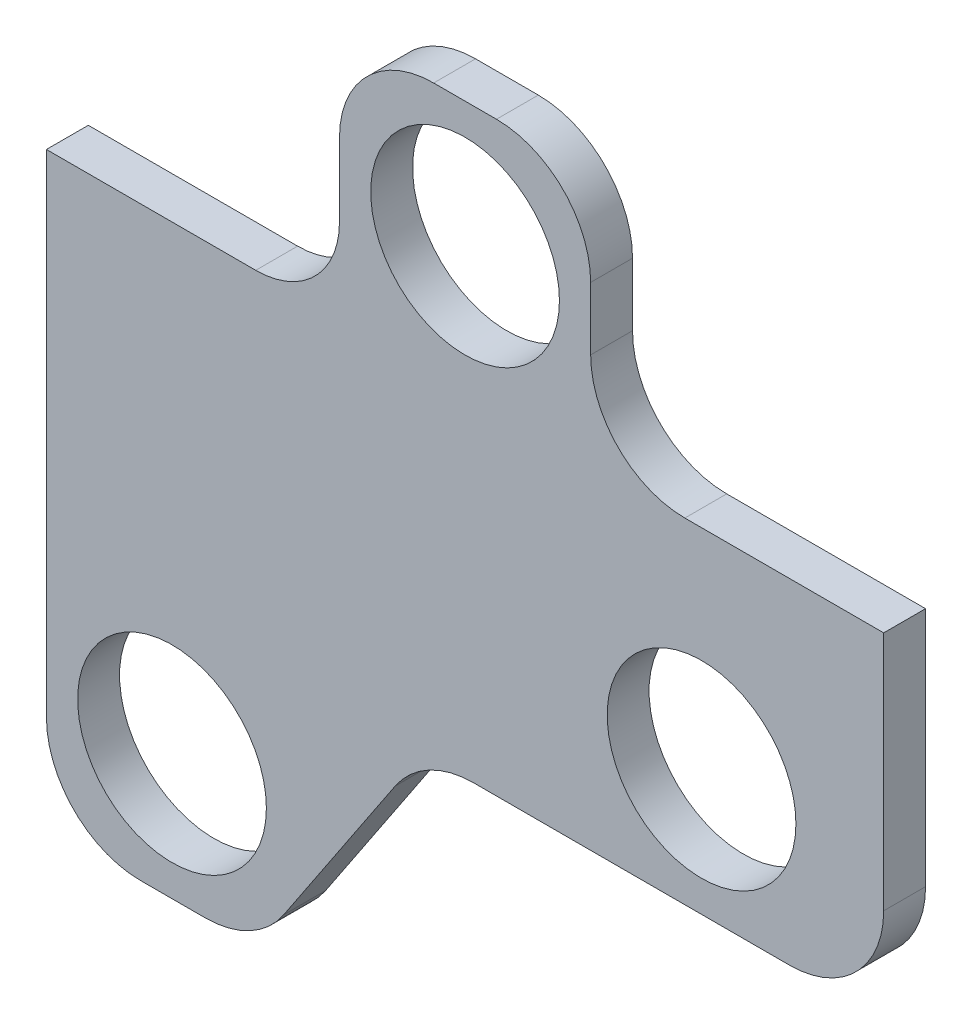
ISO-10303-21;
HEADER;
FILE_DESCRIPTION(('STEP AP214'),'2;1');
FILE_NAME('part.step','',(''),(''),'','','');
FILE_SCHEMA(('AUTOMOTIVE_DESIGN { 1 0 10303 214 1 1 1 1 }'));
ENDSEC;
DATA;
#1=APPLICATION_CONTEXT('core data for automotive mechanical design processes');
#2=APPLICATION_PROTOCOL_DEFINITION('international standard','automotive_design',2000,#1);
#3=PRODUCT_CONTEXT('',#1,'mechanical');
#4=PRODUCT('Part','Part','',(#3));
#5=PRODUCT_RELATED_PRODUCT_CATEGORY('part','',(#4));
#6=PRODUCT_DEFINITION_FORMATION('','',#4);
#7=PRODUCT_DEFINITION_CONTEXT('part definition',#1,'design');
#8=PRODUCT_DEFINITION('design','',#6,#7);
#9=PRODUCT_DEFINITION_SHAPE('','',#8);
#10=(LENGTH_UNIT() NAMED_UNIT(*) SI_UNIT(.MILLI.,.METRE.));
#11=(NAMED_UNIT(*) PLANE_ANGLE_UNIT() SI_UNIT($,.RADIAN.));
#12=(NAMED_UNIT(*) SI_UNIT($,.STERADIAN.) SOLID_ANGLE_UNIT());
#13=UNCERTAINTY_MEASURE_WITH_UNIT(LENGTH_MEASURE(1.E-05),#10,'distance_accuracy_value','');
#14=(GEOMETRIC_REPRESENTATION_CONTEXT(3) GLOBAL_UNCERTAINTY_ASSIGNED_CONTEXT((#13)) GLOBAL_UNIT_ASSIGNED_CONTEXT((#10,
#11,#12)) REPRESENTATION_CONTEXT('',''));
#15=CARTESIAN_POINT('',(0.,0.,0.));
#16=DIRECTION('',(0.,0.,1.));
#17=DIRECTION('',(1.,0.,0.));
#18=AXIS2_PLACEMENT_3D('',#15,#16,#17);
#19=CARTESIAN_POINT('',(0.,44.45,6.35));
#20=DIRECTION('',(0.,1.,0.));
#21=DIRECTION('',(0.,0.,1.));
#22=AXIS2_PLACEMENT_3D('',#19,#20,#21);
#23=PLANE('',#22);
#24=DIRECTION('',(1.,0.,0.));
#25=VECTOR('',#24,1.);
#26=CARTESIAN_POINT('',(0.,44.45,0.));
#27=LINE('',#26,#25);
#28=CARTESIAN_POINT('',(33.3375,44.45,0.));
#29=VERTEX_POINT('',#28);
#30=CARTESIAN_POINT('',(63.5,44.45,0.));
#31=VERTEX_POINT('',#30);
#32=EDGE_CURVE('E218',#29,#31,#27,.T.);
#33=ORIENTED_EDGE('',*,*,#32,.F.);
#34=DIRECTION('',(0.,0.,1.));
#35=VECTOR('',#34,1.);
#36=CARTESIAN_POINT('',(33.3375,44.45,6.35));
#37=LINE('',#36,#35);
#38=CARTESIAN_POINT('',(33.3375,44.45,6.35));
#39=VERTEX_POINT('',#38);
#40=EDGE_CURVE('E171',#29,#39,#37,.T.);
#41=ORIENTED_EDGE('',*,*,#40,.T.);
#42=DIRECTION('',(1.,0.,0.));
#43=VECTOR('',#42,1.);
#44=CARTESIAN_POINT('',(0.,44.45,6.35));
#45=LINE('',#44,#43);
#46=CARTESIAN_POINT('',(63.5,44.45,6.35));
#47=VERTEX_POINT('',#46);
#48=EDGE_CURVE('E165',#39,#47,#45,.T.);
#49=ORIENTED_EDGE('',*,*,#48,.T.);
#50=DIRECTION('',(0.,0.,-1.));
#51=VECTOR('',#50,1.);
#52=CARTESIAN_POINT('',(63.5,44.45,6.35));
#53=LINE('',#52,#51);
#54=EDGE_CURVE('E168',#47,#31,#53,.T.);
#55=ORIENTED_EDGE('',*,*,#54,.T.);
#56=EDGE_LOOP('',(#33,#41,#49,#55));
#57=FACE_BOUND('',#56,.T.);
#58=ADVANCED_FACE('F39',(#57),#23,.T.);
#59=CARTESIAN_POINT('',(-1.46538461538461,0.976923076923073,6.35));
#60=DIRECTION('',(0.832050294337844,-0.554700196225228,0.));
#61=DIRECTION('',(0.554700196225228,0.832050294337844,0.));
#62=AXIS2_PLACEMENT_3D('',#59,#60,#61);
#63=PLANE('',#62);
#64=DIRECTION('',(-0.554700196225228,-0.832050294337844,0.));
#65=VECTOR('',#64,1.);
#66=CARTESIAN_POINT('',(-1.46538461538461,0.976923076923073,0.));
#67=LINE('',#66,#65);
#68=CARTESIAN_POINT('',(-10.5914806309547,-12.712220946432,0.));
#69=VERTEX_POINT('',#68);
#70=CARTESIAN_POINT('',(-27.5085193690452,-38.0877790535679,0.));
#71=VERTEX_POINT('',#70);
#72=EDGE_CURVE('E211',#69,#71,#67,.T.);
#73=ORIENTED_EDGE('',*,*,#72,.F.);
#74=DIRECTION('',(0.,0.,-1.));
#75=VECTOR('',#74,1.);
#76=CARTESIAN_POINT('',(-10.5914806309547,-12.712220946432,6.35));
#77=LINE('',#76,#75);
#78=CARTESIAN_POINT('',(-10.5914806309547,-12.712220946432,6.35));
#79=VERTEX_POINT('',#78);
#80=EDGE_CURVE('E249',#69,#79,#77,.F.);
#81=ORIENTED_EDGE('',*,*,#80,.T.);
#82=DIRECTION('',(-0.554700196225228,-0.832050294337844,0.));
#83=VECTOR('',#82,1.);
#84=CARTESIAN_POINT('',(-1.46538461538461,0.976923076923073,6.35));
#85=LINE('',#84,#83);
#86=CARTESIAN_POINT('',(-27.5085193690452,-38.0877790535679,6.35));
#87=VERTEX_POINT('',#86);
#88=EDGE_CURVE('E194',#79,#87,#85,.T.);
#89=ORIENTED_EDGE('',*,*,#88,.T.);
#90=DIRECTION('',(0.,0.,-1.));
#91=VECTOR('',#90,1.);
#92=CARTESIAN_POINT('',(-27.5085193690453,-38.0877790535679,0.));
#93=LINE('',#92,#91);
#94=EDGE_CURVE('E246',#87,#71,#93,.T.);
#95=ORIENTED_EDGE('',*,*,#94,.T.);
#96=EDGE_LOOP('',(#73,#81,#89,#95));
#97=FACE_BOUND('',#96,.T.);
#98=ADVANCED_FACE('F323',(#97),#63,.T.);
#99=CARTESIAN_POINT('',(0.,-6.34999999999999,6.35));
#100=DIRECTION('',(0.,-1.,0.));
#101=DIRECTION('',(1.,0.,0.));
#102=AXIS2_PLACEMENT_3D('',#99,#100,#101);
#103=PLANE('',#102);
#104=DIRECTION('',(-1.,0.,0.));
#105=VECTOR('',#104,1.);
#106=CARTESIAN_POINT('',(0.,-6.34999999999999,0.));
#107=LINE('',#106,#105);
#108=CARTESIAN_POINT('',(49.2125,-6.34999999999999,0.));
#109=VERTEX_POINT('',#108);
#110=CARTESIAN_POINT('',(1.29643794939727,-6.34999999999999,0.));
#111=VERTEX_POINT('',#110);
#112=EDGE_CURVE('E214',#109,#111,#107,.T.);
#113=ORIENTED_EDGE('',*,*,#112,.F.);
#114=DIRECTION('',(0.,0.,-1.));
#115=VECTOR('',#114,1.);
#116=CARTESIAN_POINT('',(49.2125,-6.34999999999999,6.35));
#117=LINE('',#116,#115);
#118=CARTESIAN_POINT('',(49.2125,-6.34999999999999,6.35));
#119=VERTEX_POINT('',#118);
#120=EDGE_CURVE('E239',#109,#119,#117,.F.);
#121=ORIENTED_EDGE('',*,*,#120,.T.);
#122=DIRECTION('',(-1.,0.,0.));
#123=VECTOR('',#122,1.);
#124=CARTESIAN_POINT('',(0.,-6.34999999999999,6.35));
#125=LINE('',#124,#123);
#126=CARTESIAN_POINT('',(1.29643794939727,-6.34999999999999,6.35));
#127=VERTEX_POINT('',#126);
#128=EDGE_CURVE('E191',#119,#127,#125,.T.);
#129=ORIENTED_EDGE('',*,*,#128,.T.);
#130=DIRECTION('',(0.,0.,-1.));
#131=VECTOR('',#130,1.);
#132=CARTESIAN_POINT('',(1.29643794939727,-6.34999999999999,0.));
#133=LINE('',#132,#131);
#134=EDGE_CURVE('E236',#127,#111,#133,.T.);
#135=ORIENTED_EDGE('',*,*,#134,.T.);
#136=EDGE_LOOP('',(#113,#121,#129,#135));
#137=FACE_BOUND('',#136,.T.);
#138=ADVANCED_FACE('F359',(#137),#103,.T.);
#139=CARTESIAN_POINT('',(63.5,0.,6.35));
#140=DIRECTION('',(1.,0.,0.));
#141=DIRECTION('',(0.,0.,-1.));
#142=AXIS2_PLACEMENT_3D('',#139,#140,#141);
#143=PLANE('',#142);
#144=DIRECTION('',(0.,-1.,0.));
#145=VECTOR('',#144,1.);
#146=CARTESIAN_POINT('',(63.5,0.,6.35));
#147=LINE('',#146,#145);
#148=CARTESIAN_POINT('',(63.5,7.93750000000001,6.35));
#149=VERTEX_POINT('',#148);
#150=EDGE_CURVE('E174',#47,#149,#147,.T.);
#151=ORIENTED_EDGE('',*,*,#150,.T.);
#152=DIRECTION('',(0.,0.,-1.));
#153=VECTOR('',#152,1.);
#154=CARTESIAN_POINT('',(63.5,7.93750000000001,6.35));
#155=LINE('',#154,#153);
#156=CARTESIAN_POINT('',(63.5,7.93750000000001,0.));
#157=VERTEX_POINT('',#156);
#158=EDGE_CURVE('E183',#149,#157,#155,.T.);
#159=ORIENTED_EDGE('',*,*,#158,.T.);
#160=DIRECTION('',(0.,-1.,0.));
#161=VECTOR('',#160,1.);
#162=CARTESIAN_POINT('',(63.5,0.,0.));
#163=LINE('',#162,#161);
#164=EDGE_CURVE('E182',#31,#157,#163,.T.);
#165=ORIENTED_EDGE('',*,*,#164,.F.);
#166=ORIENTED_EDGE('',*,*,#54,.F.);
#167=EDGE_LOOP('',(#151,#159,#165,#166));
#168=FACE_BOUND('',#167,.T.);
#169=ADVANCED_FACE('F178',(#168),#143,.T.);
#170=CARTESIAN_POINT('',(-63.5,44.45,6.35));
#171=VERTEX_POINT('',#170);
#172=CARTESIAN_POINT('',(-31.75,44.45,6.35));
#173=VERTEX_POINT('',#172);
#174=EDGE_CURVE('E173',#171,#173,#45,.T.);
#175=ORIENTED_EDGE('',*,*,#174,.T.);
#176=DIRECTION('',(0.,0.,1.));
#177=VECTOR('',#176,1.);
#178=CARTESIAN_POINT('',(-31.75,44.45,0.));
#179=LINE('',#178,#177);
#180=CARTESIAN_POINT('',(-31.75,44.45,0.));
#181=VERTEX_POINT('',#180);
#182=EDGE_CURVE('E60',#173,#181,#179,.F.);
#183=ORIENTED_EDGE('',*,*,#182,.T.);
#184=CARTESIAN_POINT('',(-63.5,44.45,0.));
#185=VERTEX_POINT('',#184);
#186=EDGE_CURVE('E219',#185,#181,#27,.T.);
#187=ORIENTED_EDGE('',*,*,#186,.F.);
#188=DIRECTION('',(0.,0.,-1.));
#189=VECTOR('',#188,1.);
#190=CARTESIAN_POINT('',(-63.5,44.45,6.35));
#191=LINE('',#190,#189);
#192=EDGE_CURVE('E184',#171,#185,#191,.T.);
#193=ORIENTED_EDGE('',*,*,#192,.F.);
#194=EDGE_LOOP('',(#175,#183,#187,#193));
#195=FACE_BOUND('',#194,.T.);
#196=ADVANCED_FACE('F345',(#195),#23,.T.);
#197=CARTESIAN_POINT('',(-63.5,0.,6.35));
#198=DIRECTION('',(1.,0.,0.));
#199=DIRECTION('',(0.,1.,0.));
#200=AXIS2_PLACEMENT_3D('',#197,#198,#199);
#201=PLANE('',#200);
#202=DIRECTION('',(0.,-1.,0.));
#203=VECTOR('',#202,1.);
#204=CARTESIAN_POINT('',(-63.5,0.,0.));
#205=LINE('',#204,#203);
#206=CARTESIAN_POINT('',(-63.4999999999999,-30.1625,0.));
#207=VERTEX_POINT('',#206);
#208=EDGE_CURVE('E221',#185,#207,#205,.T.);
#209=ORIENTED_EDGE('',*,*,#208,.T.);
#210=DIRECTION('',(0.,0.,-1.));
#211=VECTOR('',#210,1.);
#212=CARTESIAN_POINT('',(-63.4999999999999,-30.1625,6.35));
#213=LINE('',#212,#211);
#214=CARTESIAN_POINT('',(-63.4999999999999,-30.1625,6.35));
#215=VERTEX_POINT('',#214);
#216=EDGE_CURVE('E256',#207,#215,#213,.F.);
#217=ORIENTED_EDGE('',*,*,#216,.T.);
#218=DIRECTION('',(0.,-1.,0.));
#219=VECTOR('',#218,1.);
#220=CARTESIAN_POINT('',(-63.5,0.,6.35));
#221=LINE('',#220,#219);
#222=EDGE_CURVE('E198',#171,#215,#221,.T.);
#223=ORIENTED_EDGE('',*,*,#222,.F.);
#224=ORIENTED_EDGE('',*,*,#192,.T.);
#225=EDGE_LOOP('',(#209,#217,#223,#224));
#226=FACE_BOUND('',#225,.T.);
#227=ADVANCED_FACE('F343',(#226),#201,.F.);
#228=CARTESIAN_POINT('',(-44.45,-25.4,6.35));
#229=DIRECTION('',(0.,0.,-1.));
#230=DIRECTION('',(-1.,0.,0.));
#231=AXIS2_PLACEMENT_3D('',#228,#229,#230);
#232=CYLINDRICAL_SURFACE('',#231,14.3129);
#233=CARTESIAN_POINT('',(-44.45,-25.4,6.35));
#234=DIRECTION('',(0.,0.,1.));
#235=DIRECTION('',(1.,0.,0.));
#236=AXIS2_PLACEMENT_3D('',#233,#234,#235);
#237=CIRCLE('',#236,14.3129);
#238=CARTESIAN_POINT('',(-30.1371,-25.4,6.35));
#239=VERTEX_POINT('',#238);
#240=EDGE_CURVE('E316',#239,#239,#237,.T.);
#241=ORIENTED_EDGE('',*,*,#240,.T.);
#242=EDGE_LOOP('',(#241));
#243=FACE_BOUND('',#242,.T.);
#244=CARTESIAN_POINT('',(-44.45,-25.4,0.));
#245=DIRECTION('',(0.,0.,1.));
#246=DIRECTION('',(1.,0.,0.));
#247=AXIS2_PLACEMENT_3D('',#244,#245,#246);
#248=CIRCLE('',#247,14.3129);
#249=CARTESIAN_POINT('',(-30.1371,-25.4,0.));
#250=VERTEX_POINT('',#249);
#251=EDGE_CURVE('E207',#250,#250,#248,.T.);
#252=ORIENTED_EDGE('',*,*,#251,.F.);
#253=EDGE_LOOP('',(#252));
#254=FACE_BOUND('',#253,.T.);
#255=ADVANCED_FACE('F368',(#243,#254),#232,.F.);
#256=CARTESIAN_POINT('',(35.8718525682768,12.7,6.35));
#257=DIRECTION('',(0.,0.,-1.));
#258=DIRECTION('',(-1.,0.,0.));
#259=AXIS2_PLACEMENT_3D('',#256,#257,#258);
#260=CYLINDRICAL_SURFACE('',#259,14.3129);
#261=CARTESIAN_POINT('',(35.8718525682768,12.7,6.35));
#262=DIRECTION('',(0.,0.,1.));
#263=DIRECTION('',(1.,0.,0.));
#264=AXIS2_PLACEMENT_3D('',#261,#262,#263);
#265=CIRCLE('',#264,14.3129);
#266=CARTESIAN_POINT('',(50.1847525682768,12.7,6.35));
#267=VERTEX_POINT('',#266);
#268=EDGE_CURVE('E227',#267,#267,#265,.T.);
#269=ORIENTED_EDGE('',*,*,#268,.T.);
#270=EDGE_LOOP('',(#269));
#271=FACE_BOUND('',#270,.T.);
#272=CARTESIAN_POINT('',(35.8718525682768,12.7,0.));
#273=DIRECTION('',(0.,0.,1.));
#274=DIRECTION('',(1.,0.,0.));
#275=AXIS2_PLACEMENT_3D('',#272,#273,#274);
#276=CIRCLE('',#275,14.3129);
#277=CARTESIAN_POINT('',(50.1847525682768,12.7,0.));
#278=VERTEX_POINT('',#277);
#279=EDGE_CURVE('E204',#278,#278,#276,.T.);
#280=ORIENTED_EDGE('',*,*,#279,.F.);
#281=EDGE_LOOP('',(#280));
#282=FACE_BOUND('',#281,.T.);
#283=ADVANCED_FACE('F377',(#271,#282),#260,.F.);
#284=CARTESIAN_POINT('',(0.,-44.45,6.35));
#285=DIRECTION('',(0.,1.,0.));
#286=DIRECTION('',(0.,0.,1.));
#287=AXIS2_PLACEMENT_3D('',#284,#285,#286);
#288=PLANE('',#287);
#289=DIRECTION('',(1.,0.,0.));
#290=VECTOR('',#289,1.);
#291=CARTESIAN_POINT('',(0.,-44.45,0.));
#292=LINE('',#291,#290);
#293=CARTESIAN_POINT('',(-49.2124999999999,-44.45,0.));
#294=VERTEX_POINT('',#293);
#295=CARTESIAN_POINT('',(-39.3964379493972,-44.45,0.));
#296=VERTEX_POINT('',#295);
#297=EDGE_CURVE('E224',#294,#296,#292,.T.);
#298=ORIENTED_EDGE('',*,*,#297,.T.);
#299=DIRECTION('',(0.,0.,-1.));
#300=VECTOR('',#299,1.);
#301=CARTESIAN_POINT('',(-39.3964379493972,-44.45,6.35));
#302=LINE('',#301,#300);
#303=CARTESIAN_POINT('',(-39.3964379493972,-44.45,6.35));
#304=VERTEX_POINT('',#303);
#305=EDGE_CURVE('E254',#296,#304,#302,.F.);
#306=ORIENTED_EDGE('',*,*,#305,.T.);
#307=DIRECTION('',(1.,0.,0.));
#308=VECTOR('',#307,1.);
#309=CARTESIAN_POINT('',(0.,-44.45,6.35));
#310=LINE('',#309,#308);
#311=CARTESIAN_POINT('',(-49.2124999999999,-44.45,6.35));
#312=VERTEX_POINT('',#311);
#313=EDGE_CURVE('E201',#312,#304,#310,.T.);
#314=ORIENTED_EDGE('',*,*,#313,.F.);
#315=DIRECTION('',(0.,0.,-1.));
#316=VECTOR('',#315,1.);
#317=CARTESIAN_POINT('',(-49.2124999999999,-44.45,6.35));
#318=LINE('',#317,#316);
#319=EDGE_CURVE('E251',#312,#294,#318,.T.);
#320=ORIENTED_EDGE('',*,*,#319,.T.);
#321=EDGE_LOOP('',(#298,#306,#314,#320));
#322=FACE_BOUND('',#321,.T.);
#323=ADVANCED_FACE('F334',(#322),#288,.F.);
#324=CARTESIAN_POINT('',(0.,0.,6.35));
#325=DIRECTION('',(0.,0.,1.));
#326=DIRECTION('',(1.,0.,0.));
#327=AXIS2_PLACEMENT_3D('',#324,#325,#326);
#328=PLANE('',#327);
#329=CARTESIAN_POINT('',(0.,63.5,6.35));
#330=DIRECTION('',(0.,0.,1.));
#331=DIRECTION('',(1.,0.,0.));
#332=AXIS2_PLACEMENT_3D('',#329,#330,#331);
#333=CIRCLE('',#332,14.3129);
#334=CARTESIAN_POINT('',(14.3129,63.5,6.35));
#335=VERTEX_POINT('',#334);
#336=EDGE_CURVE('E308',#335,#335,#333,.T.);
#337=ORIENTED_EDGE('',*,*,#336,.F.);
#338=EDGE_LOOP('',(#337));
#339=FACE_BOUND('',#338,.T.);
#340=ORIENTED_EDGE('',*,*,#268,.F.);
#341=EDGE_LOOP('',(#340));
#342=FACE_BOUND('',#341,.T.);
#343=ORIENTED_EDGE('',*,*,#240,.F.);
#344=EDGE_LOOP('',(#343));
#345=FACE_BOUND('',#344,.T.);
#346=DIRECTION('',(-1.,0.,0.));
#347=VECTOR('',#346,1.);
#348=CARTESIAN_POINT('',(-19.05,82.55,6.35));
#349=LINE('',#348,#347);
#350=CARTESIAN_POINT('',(4.76250000000002,82.55,6.35));
#351=VERTEX_POINT('',#350);
#352=CARTESIAN_POINT('',(-4.76249999999998,82.55,6.35));
#353=VERTEX_POINT('',#352);
#354=EDGE_CURVE('E305',#351,#353,#349,.T.);
#355=ORIENTED_EDGE('',*,*,#354,.T.);
#356=CARTESIAN_POINT('',(-4.76249999999998,68.2625,6.35));
#357=DIRECTION('',(0.,0.,1.));
#358=DIRECTION('',(1.,0.,0.));
#359=AXIS2_PLACEMENT_3D('',#356,#357,#358);
#360=CIRCLE('',#359,14.2875);
#361=CARTESIAN_POINT('',(-19.05,68.2625,6.35));
#362=VERTEX_POINT('',#361);
#363=EDGE_CURVE('E269',#353,#362,#360,.T.);
#364=ORIENTED_EDGE('',*,*,#363,.T.);
#365=DIRECTION('',(0.,-1.,0.));
#366=VECTOR('',#365,1.);
#367=CARTESIAN_POINT('',(-19.05,44.45,6.35));
#368=LINE('',#367,#366);
#369=CARTESIAN_POINT('',(-19.05,57.15,6.35));
#370=VERTEX_POINT('',#369);
#371=EDGE_CURVE('E295',#362,#370,#368,.T.);
#372=ORIENTED_EDGE('',*,*,#371,.T.);
#373=CARTESIAN_POINT('',(-31.75,57.15,6.35));
#374=DIRECTION('',(0.,0.,1.));
#375=DIRECTION('',(1.,0.,0.));
#376=AXIS2_PLACEMENT_3D('',#373,#374,#375);
#377=CIRCLE('',#376,12.7);
#378=EDGE_CURVE('E47',#370,#173,#377,.F.);
#379=ORIENTED_EDGE('',*,*,#378,.T.);
#380=ORIENTED_EDGE('',*,*,#174,.F.);
#381=ORIENTED_EDGE('',*,*,#222,.T.);
#382=CARTESIAN_POINT('',(-49.2124999999999,-30.1625,6.35));
#383=DIRECTION('',(0.,0.,1.));
#384=DIRECTION('',(1.,0.,0.));
#385=AXIS2_PLACEMENT_3D('',#382,#383,#384);
#386=CIRCLE('',#385,14.2875);
#387=EDGE_CURVE('E241',#215,#312,#386,.T.);
#388=ORIENTED_EDGE('',*,*,#387,.T.);
#389=ORIENTED_EDGE('',*,*,#313,.T.);
#390=CARTESIAN_POINT('',(-39.3964379493972,-30.1625,6.35));
#391=DIRECTION('',(0.,0.,1.));
#392=DIRECTION('',(1.,0.,0.));
#393=AXIS2_PLACEMENT_3D('',#390,#391,#392);
#394=CIRCLE('',#393,14.2875);
#395=EDGE_CURVE('E243',#304,#87,#394,.T.);
#396=ORIENTED_EDGE('',*,*,#395,.T.);
#397=ORIENTED_EDGE('',*,*,#88,.F.);
#398=CARTESIAN_POINT('',(1.29643794939727,-20.6375,6.35));
#399=DIRECTION('',(0.,0.,1.));
#400=DIRECTION('',(1.,0.,0.));
#401=AXIS2_PLACEMENT_3D('',#398,#399,#400);
#402=CIRCLE('',#401,14.2875);
#403=EDGE_CURVE('E260',#79,#127,#402,.F.);
#404=ORIENTED_EDGE('',*,*,#403,.T.);
#405=ORIENTED_EDGE('',*,*,#128,.F.);
#406=CARTESIAN_POINT('',(49.2125,7.93750000000001,6.35));
#407=DIRECTION('',(0.,0.,1.));
#408=DIRECTION('',(1.,0.,0.));
#409=AXIS2_PLACEMENT_3D('',#406,#407,#408);
#410=CIRCLE('',#409,14.2875);
#411=EDGE_CURVE('E190',#119,#149,#410,.T.);
#412=ORIENTED_EDGE('',*,*,#411,.T.);
#413=ORIENTED_EDGE('',*,*,#150,.F.);
#414=ORIENTED_EDGE('',*,*,#48,.F.);
#415=CARTESIAN_POINT('',(33.3375,58.7375,6.35));
#416=DIRECTION('',(0.,0.,1.));
#417=DIRECTION('',(1.,0.,0.));
#418=AXIS2_PLACEMENT_3D('',#415,#416,#417);
#419=CIRCLE('',#418,14.2875);
#420=CARTESIAN_POINT('',(19.05,58.7375,6.35));
#421=VERTEX_POINT('',#420);
#422=EDGE_CURVE('E283',#39,#421,#419,.F.);
#423=ORIENTED_EDGE('',*,*,#422,.T.);
#424=DIRECTION('',(0.,1.,0.));
#425=VECTOR('',#424,1.);
#426=CARTESIAN_POINT('',(19.05,44.45,6.35));
#427=LINE('',#426,#425);
#428=CARTESIAN_POINT('',(19.05,68.2625,6.35));
#429=VERTEX_POINT('',#428);
#430=EDGE_CURVE('E301',#421,#429,#427,.T.);
#431=ORIENTED_EDGE('',*,*,#430,.T.);
#432=CARTESIAN_POINT('',(4.76250000000003,68.2625,6.35));
#433=DIRECTION('',(0.,0.,1.));
#434=DIRECTION('',(1.,0.,0.));
#435=AXIS2_PLACEMENT_3D('',#432,#433,#434);
#436=CIRCLE('',#435,14.2875);
#437=EDGE_CURVE('E267',#429,#351,#436,.T.);
#438=ORIENTED_EDGE('',*,*,#437,.T.);
#439=EDGE_LOOP('',(#355,#364,#372,#379,#380,#381,#388,#389,#396,#397,#404,#405,#412,#413,#414,
#423,#431,#438));
#440=FACE_BOUND('',#439,.T.);
#441=ADVANCED_FACE('F187',(#339,#342,#345,#440),#328,.T.);
#442=CARTESIAN_POINT('',(0.,0.,0.));
#443=DIRECTION('',(0.,0.,1.));
#444=DIRECTION('',(1.,0.,0.));
#445=AXIS2_PLACEMENT_3D('',#442,#443,#444);
#446=PLANE('',#445);
#447=CARTESIAN_POINT('',(0.,63.5,0.));
#448=DIRECTION('',(0.,0.,1.));
#449=DIRECTION('',(1.,0.,0.));
#450=AXIS2_PLACEMENT_3D('',#447,#448,#449);
#451=CIRCLE('',#450,14.3129);
#452=CARTESIAN_POINT('',(14.3129,63.5,0.));
#453=VERTEX_POINT('',#452);
#454=EDGE_CURVE('E302',#453,#453,#451,.T.);
#455=ORIENTED_EDGE('',*,*,#454,.T.);
#456=EDGE_LOOP('',(#455));
#457=FACE_BOUND('',#456,.T.);
#458=ORIENTED_EDGE('',*,*,#279,.T.);
#459=EDGE_LOOP('',(#458));
#460=FACE_BOUND('',#459,.T.);
#461=ORIENTED_EDGE('',*,*,#251,.T.);
#462=EDGE_LOOP('',(#461));
#463=FACE_BOUND('',#462,.T.);
#464=DIRECTION('',(0.,-1.,0.));
#465=VECTOR('',#464,1.);
#466=CARTESIAN_POINT('',(-19.05,44.45,0.));
#467=LINE('',#466,#465);
#468=CARTESIAN_POINT('',(-19.05,68.2625,0.));
#469=VERTEX_POINT('',#468);
#470=CARTESIAN_POINT('',(-19.05,57.15,0.));
#471=VERTEX_POINT('',#470);
#472=EDGE_CURVE('E298',#469,#471,#467,.T.);
#473=ORIENTED_EDGE('',*,*,#472,.F.);
#474=CARTESIAN_POINT('',(-4.76249999999998,68.2625,0.));
#475=DIRECTION('',(0.,0.,1.));
#476=DIRECTION('',(1.,0.,0.));
#477=AXIS2_PLACEMENT_3D('',#474,#475,#476);
#478=CIRCLE('',#477,14.2875);
#479=CARTESIAN_POINT('',(-4.76249999999998,82.55,0.));
#480=VERTEX_POINT('',#479);
#481=EDGE_CURVE('E275',#469,#480,#478,.F.);
#482=ORIENTED_EDGE('',*,*,#481,.T.);
#483=DIRECTION('',(-1.,0.,0.));
#484=VECTOR('',#483,1.);
#485=CARTESIAN_POINT('',(-19.05,82.55,0.));
#486=LINE('',#485,#484);
#487=CARTESIAN_POINT('',(4.76250000000002,82.55,0.));
#488=VERTEX_POINT('',#487);
#489=EDGE_CURVE('E208',#488,#480,#486,.T.);
#490=ORIENTED_EDGE('',*,*,#489,.F.);
#491=CARTESIAN_POINT('',(4.76250000000003,68.2625,0.));
#492=DIRECTION('',(0.,0.,1.));
#493=DIRECTION('',(1.,0.,0.));
#494=AXIS2_PLACEMENT_3D('',#491,#492,#493);
#495=CIRCLE('',#494,14.2875);
#496=CARTESIAN_POINT('',(19.05,68.2625,0.));
#497=VERTEX_POINT('',#496);
#498=EDGE_CURVE('E273',#488,#497,#495,.F.);
#499=ORIENTED_EDGE('',*,*,#498,.T.);
#500=DIRECTION('',(0.,1.,0.));
#501=VECTOR('',#500,1.);
#502=CARTESIAN_POINT('',(19.05,44.45,0.));
#503=LINE('',#502,#501);
#504=CARTESIAN_POINT('',(19.05,58.7375,0.));
#505=VERTEX_POINT('',#504);
#506=EDGE_CURVE('E410',#505,#497,#503,.T.);
#507=ORIENTED_EDGE('',*,*,#506,.F.);
#508=CARTESIAN_POINT('',(33.3375,58.7375,0.));
#509=DIRECTION('',(0.,0.,1.));
#510=DIRECTION('',(1.,0.,0.));
#511=AXIS2_PLACEMENT_3D('',#508,#509,#510);
#512=CIRCLE('',#511,14.2875);
#513=EDGE_CURVE('E285',#505,#29,#512,.T.);
#514=ORIENTED_EDGE('',*,*,#513,.T.);
#515=ORIENTED_EDGE('',*,*,#32,.T.);
#516=ORIENTED_EDGE('',*,*,#164,.T.);
#517=CARTESIAN_POINT('',(49.2125,7.93750000000001,0.));
#518=DIRECTION('',(0.,0.,1.));
#519=DIRECTION('',(1.,0.,0.));
#520=AXIS2_PLACEMENT_3D('',#517,#518,#519);
#521=CIRCLE('',#520,14.2875);
#522=EDGE_CURVE('E234',#157,#109,#521,.F.);
#523=ORIENTED_EDGE('',*,*,#522,.T.);
#524=ORIENTED_EDGE('',*,*,#112,.T.);
#525=CARTESIAN_POINT('',(1.29643794939727,-20.6375,0.));
#526=DIRECTION('',(0.,0.,1.));
#527=DIRECTION('',(1.,0.,0.));
#528=AXIS2_PLACEMENT_3D('',#525,#526,#527);
#529=CIRCLE('',#528,14.2875);
#530=EDGE_CURVE('E258',#111,#69,#529,.T.);
#531=ORIENTED_EDGE('',*,*,#530,.T.);
#532=ORIENTED_EDGE('',*,*,#72,.T.);
#533=CARTESIAN_POINT('',(-39.3964379493972,-30.1625,0.));
#534=DIRECTION('',(0.,0.,1.));
#535=DIRECTION('',(1.,0.,0.));
#536=AXIS2_PLACEMENT_3D('',#533,#534,#535);
#537=CIRCLE('',#536,14.2875);
#538=EDGE_CURVE('E232',#71,#296,#537,.F.);
#539=ORIENTED_EDGE('',*,*,#538,.T.);
#540=ORIENTED_EDGE('',*,*,#297,.F.);
#541=CARTESIAN_POINT('',(-49.2124999999999,-30.1625,0.));
#542=DIRECTION('',(0.,0.,1.));
#543=DIRECTION('',(1.,0.,0.));
#544=AXIS2_PLACEMENT_3D('',#541,#542,#543);
#545=CIRCLE('',#544,14.2875);
#546=EDGE_CURVE('E230',#294,#207,#545,.F.);
#547=ORIENTED_EDGE('',*,*,#546,.T.);
#548=ORIENTED_EDGE('',*,*,#208,.F.);
#549=ORIENTED_EDGE('',*,*,#186,.T.);
#550=CARTESIAN_POINT('',(-31.75,57.15,0.));
#551=DIRECTION('',(0.,0.,1.));
#552=DIRECTION('',(1.,0.,0.));
#553=AXIS2_PLACEMENT_3D('',#550,#551,#552);
#554=CIRCLE('',#553,12.7);
#555=EDGE_CURVE('E11',#181,#471,#554,.T.);
#556=ORIENTED_EDGE('',*,*,#555,.T.);
#557=EDGE_LOOP('',(#473,#482,#490,#499,#507,#514,#515,#516,#523,#524,#531,#532,#539,#540,#547,
#548,#549,#556));
#558=FACE_BOUND('',#557,.T.);
#559=ADVANCED_FACE('F332',(#457,#460,#463,#558),#446,.F.);
#560=CARTESIAN_POINT('',(49.2125,7.93750000000001,6.35));
#561=DIRECTION('',(0.,0.,-1.));
#562=DIRECTION('',(-1.,0.,0.));
#563=AXIS2_PLACEMENT_3D('',#560,#561,#562);
#564=CYLINDRICAL_SURFACE('',#563,14.2875);
#565=ORIENTED_EDGE('',*,*,#411,.F.);
#566=ORIENTED_EDGE('',*,*,#120,.F.);
#567=ORIENTED_EDGE('',*,*,#522,.F.);
#568=ORIENTED_EDGE('',*,*,#158,.F.);
#569=EDGE_LOOP('',(#565,#566,#567,#568));
#570=FACE_BOUND('',#569,.T.);
#571=ADVANCED_FACE('F382',(#570),#564,.T.);
#572=CARTESIAN_POINT('',(1.29643794939727,-20.6375,6.35));
#573=DIRECTION('',(0.,0.,1.));
#574=DIRECTION('',(1.,0.,0.));
#575=AXIS2_PLACEMENT_3D('',#572,#573,#574);
#576=CYLINDRICAL_SURFACE('',#575,14.2875);
#577=ORIENTED_EDGE('',*,*,#403,.F.);
#578=ORIENTED_EDGE('',*,*,#80,.F.);
#579=ORIENTED_EDGE('',*,*,#530,.F.);
#580=ORIENTED_EDGE('',*,*,#134,.F.);
#581=EDGE_LOOP('',(#577,#578,#579,#580));
#582=FACE_BOUND('',#581,.T.);
#583=ADVANCED_FACE('F385',(#582),#576,.F.);
#584=CARTESIAN_POINT('',(-39.3964379493972,-30.1625,6.35));
#585=DIRECTION('',(0.,0.,1.));
#586=DIRECTION('',(1.,0.,0.));
#587=AXIS2_PLACEMENT_3D('',#584,#585,#586);
#588=CYLINDRICAL_SURFACE('',#587,14.2875);
#589=ORIENTED_EDGE('',*,*,#395,.F.);
#590=ORIENTED_EDGE('',*,*,#305,.F.);
#591=ORIENTED_EDGE('',*,*,#538,.F.);
#592=ORIENTED_EDGE('',*,*,#94,.F.);
#593=EDGE_LOOP('',(#589,#590,#591,#592));
#594=FACE_BOUND('',#593,.T.);
#595=ADVANCED_FACE('F328',(#594),#588,.T.);
#596=CARTESIAN_POINT('',(-49.2124999999999,-30.1625,6.35));
#597=DIRECTION('',(0.,0.,-1.));
#598=DIRECTION('',(-1.,0.,0.));
#599=AXIS2_PLACEMENT_3D('',#596,#597,#598);
#600=CYLINDRICAL_SURFACE('',#599,14.2875);
#601=ORIENTED_EDGE('',*,*,#387,.F.);
#602=ORIENTED_EDGE('',*,*,#216,.F.);
#603=ORIENTED_EDGE('',*,*,#546,.F.);
#604=ORIENTED_EDGE('',*,*,#319,.F.);
#605=EDGE_LOOP('',(#601,#602,#603,#604));
#606=FACE_BOUND('',#605,.T.);
#607=ADVANCED_FACE('F339',(#606),#600,.T.);
#608=CARTESIAN_POINT('',(-19.05,44.45,0.));
#609=DIRECTION('',(-1.,0.,0.));
#610=DIRECTION('',(0.,0.,1.));
#611=AXIS2_PLACEMENT_3D('',#608,#609,#610);
#612=PLANE('',#611);
#613=ORIENTED_EDGE('',*,*,#472,.T.);
#614=DIRECTION('',(0.,0.,1.));
#615=VECTOR('',#614,1.);
#616=CARTESIAN_POINT('',(-19.05,57.15,6.35));
#617=LINE('',#616,#615);
#618=EDGE_CURVE('E287',#471,#370,#617,.T.);
#619=ORIENTED_EDGE('',*,*,#618,.T.);
#620=ORIENTED_EDGE('',*,*,#371,.F.);
#621=DIRECTION('',(0.,0.,1.));
#622=VECTOR('',#621,1.);
#623=CARTESIAN_POINT('',(-19.05,68.2625,0.));
#624=LINE('',#623,#622);
#625=EDGE_CURVE('E271',#362,#469,#624,.F.);
#626=ORIENTED_EDGE('',*,*,#625,.T.);
#627=EDGE_LOOP('',(#613,#619,#620,#626));
#628=FACE_BOUND('',#627,.T.);
#629=ADVANCED_FACE('F294',(#628),#612,.T.);
#630=CARTESIAN_POINT('',(-19.05,82.55,0.));
#631=DIRECTION('',(0.,1.,0.));
#632=DIRECTION('',(0.,0.,1.));
#633=AXIS2_PLACEMENT_3D('',#630,#631,#632);
#634=PLANE('',#633);
#635=ORIENTED_EDGE('',*,*,#489,.T.);
#636=DIRECTION('',(0.,0.,1.));
#637=VECTOR('',#636,1.);
#638=CARTESIAN_POINT('',(-4.76249999999998,82.55,0.));
#639=LINE('',#638,#637);
#640=EDGE_CURVE('E264',#480,#353,#639,.T.);
#641=ORIENTED_EDGE('',*,*,#640,.T.);
#642=ORIENTED_EDGE('',*,*,#354,.F.);
#643=DIRECTION('',(0.,0.,1.));
#644=VECTOR('',#643,1.);
#645=CARTESIAN_POINT('',(4.76250000000002,82.55,0.));
#646=LINE('',#645,#644);
#647=EDGE_CURVE('E262',#351,#488,#646,.F.);
#648=ORIENTED_EDGE('',*,*,#647,.T.);
#649=EDGE_LOOP('',(#635,#641,#642,#648));
#650=FACE_BOUND('',#649,.T.);
#651=ADVANCED_FACE('F468',(#650),#634,.T.);
#652=CARTESIAN_POINT('',(19.05,44.45,0.));
#653=DIRECTION('',(1.,0.,0.));
#654=DIRECTION('',(0.,0.,-1.));
#655=AXIS2_PLACEMENT_3D('',#652,#653,#654);
#656=PLANE('',#655);
#657=ORIENTED_EDGE('',*,*,#506,.T.);
#658=DIRECTION('',(0.,0.,1.));
#659=VECTOR('',#658,1.);
#660=CARTESIAN_POINT('',(19.05,68.2625,0.));
#661=LINE('',#660,#659);
#662=EDGE_CURVE('E279',#497,#429,#661,.T.);
#663=ORIENTED_EDGE('',*,*,#662,.T.);
#664=ORIENTED_EDGE('',*,*,#430,.F.);
#665=DIRECTION('',(0.,0.,1.));
#666=VECTOR('',#665,1.);
#667=CARTESIAN_POINT('',(19.05,58.7375,0.));
#668=LINE('',#667,#666);
#669=EDGE_CURVE('E277',#421,#505,#668,.F.);
#670=ORIENTED_EDGE('',*,*,#669,.T.);
#671=EDGE_LOOP('',(#657,#663,#664,#670));
#672=FACE_BOUND('',#671,.T.);
#673=ADVANCED_FACE('F398',(#672),#656,.T.);
#674=CARTESIAN_POINT('',(-4.76249999999998,68.2625,0.));
#675=DIRECTION('',(0.,0.,1.));
#676=DIRECTION('',(1.,0.,0.));
#677=AXIS2_PLACEMENT_3D('',#674,#675,#676);
#678=CYLINDRICAL_SURFACE('',#677,14.2875);
#679=ORIENTED_EDGE('',*,*,#481,.F.);
#680=ORIENTED_EDGE('',*,*,#625,.F.);
#681=ORIENTED_EDGE('',*,*,#363,.F.);
#682=ORIENTED_EDGE('',*,*,#640,.F.);
#683=EDGE_LOOP('',(#679,#680,#681,#682));
#684=FACE_BOUND('',#683,.T.);
#685=ADVANCED_FACE('F394',(#684),#678,.T.);
#686=CARTESIAN_POINT('',(4.76250000000003,68.2625,0.));
#687=DIRECTION('',(0.,0.,1.));
#688=DIRECTION('',(1.,0.,0.));
#689=AXIS2_PLACEMENT_3D('',#686,#687,#688);
#690=CYLINDRICAL_SURFACE('',#689,14.2875);
#691=ORIENTED_EDGE('',*,*,#498,.F.);
#692=ORIENTED_EDGE('',*,*,#647,.F.);
#693=ORIENTED_EDGE('',*,*,#437,.F.);
#694=ORIENTED_EDGE('',*,*,#662,.F.);
#695=EDGE_LOOP('',(#691,#692,#693,#694));
#696=FACE_BOUND('',#695,.T.);
#697=ADVANCED_FACE('F397',(#696),#690,.T.);
#698=CARTESIAN_POINT('',(33.3375,58.7375,6.35));
#699=DIRECTION('',(0.,0.,-1.));
#700=DIRECTION('',(-1.,0.,0.));
#701=AXIS2_PLACEMENT_3D('',#698,#699,#700);
#702=CYLINDRICAL_SURFACE('',#701,14.2875);
#703=ORIENTED_EDGE('',*,*,#513,.F.);
#704=ORIENTED_EDGE('',*,*,#669,.F.);
#705=ORIENTED_EDGE('',*,*,#422,.F.);
#706=ORIENTED_EDGE('',*,*,#40,.F.);
#707=EDGE_LOOP('',(#703,#704,#705,#706));
#708=FACE_BOUND('',#707,.T.);
#709=ADVANCED_FACE('F351',(#708),#702,.F.);
#710=CARTESIAN_POINT('',(0.,63.5,0.));
#711=DIRECTION('',(0.,0.,1.));
#712=DIRECTION('',(1.,0.,0.));
#713=AXIS2_PLACEMENT_3D('',#710,#711,#712);
#714=CYLINDRICAL_SURFACE('',#713,14.3129);
#715=ORIENTED_EDGE('',*,*,#454,.F.);
#716=EDGE_LOOP('',(#715));
#717=FACE_BOUND('',#716,.T.);
#718=ORIENTED_EDGE('',*,*,#336,.T.);
#719=EDGE_LOOP('',(#718));
#720=FACE_BOUND('',#719,.T.);
#721=ADVANCED_FACE('F347',(#717,#720),#714,.F.);
#722=CARTESIAN_POINT('',(-31.75,57.15,0.));
#723=DIRECTION('',(0.,0.,-1.));
#724=DIRECTION('',(-1.,0.,0.));
#725=AXIS2_PLACEMENT_3D('',#722,#723,#724);
#726=CYLINDRICAL_SURFACE('',#725,12.7);
#727=ORIENTED_EDGE('',*,*,#555,.F.);
#728=ORIENTED_EDGE('',*,*,#182,.F.);
#729=ORIENTED_EDGE('',*,*,#378,.F.);
#730=ORIENTED_EDGE('',*,*,#618,.F.);
#731=EDGE_LOOP('',(#727,#728,#729,#730));
#732=FACE_BOUND('',#731,.T.);
#733=ADVANCED_FACE('F41',(#732),#726,.F.);
#734=CLOSED_SHELL('',(#58,#98,#138,#169,#196,#227,#255,#283,#323,#441,#559,#571,#583,#595,#607,
#629,#651,#673,#685,#697,#709,#721,#733));
#735=MANIFOLD_SOLID_BREP('B2',#734);
#736=ADVANCED_BREP_SHAPE_REPRESENTATION('',(#18,#735),#14);
#737=SHAPE_DEFINITION_REPRESENTATION(#9,#736);
ENDSEC;
END-ISO-10303-21;
